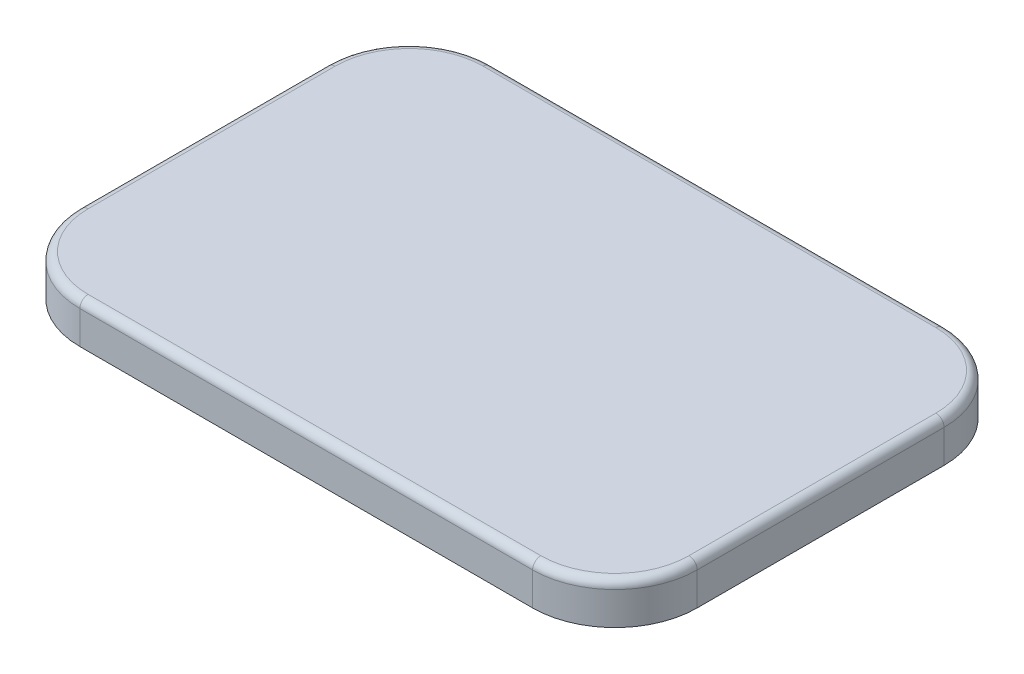
ISO-10303-21;
HEADER;
FILE_DESCRIPTION(('STEP AP214'),'2;1');
FILE_NAME('part.step','',(''),(''),'','','');
FILE_SCHEMA(('AUTOMOTIVE_DESIGN { 1 0 10303 214 1 1 1 1 }'));
ENDSEC;
DATA;
#1=APPLICATION_CONTEXT('core data for automotive mechanical design processes');
#2=APPLICATION_PROTOCOL_DEFINITION('international standard','automotive_design',2000,#1);
#3=PRODUCT_CONTEXT('',#1,'mechanical');
#4=PRODUCT('Part','Part','',(#3));
#5=PRODUCT_RELATED_PRODUCT_CATEGORY('part','',(#4));
#6=PRODUCT_DEFINITION_FORMATION('','',#4);
#7=PRODUCT_DEFINITION_CONTEXT('part definition',#1,'design');
#8=PRODUCT_DEFINITION('design','',#6,#7);
#9=PRODUCT_DEFINITION_SHAPE('','',#8);
#10=(LENGTH_UNIT() NAMED_UNIT(*) SI_UNIT(.MILLI.,.METRE.));
#11=(NAMED_UNIT(*) PLANE_ANGLE_UNIT() SI_UNIT($,.RADIAN.));
#12=(NAMED_UNIT(*) SI_UNIT($,.STERADIAN.) SOLID_ANGLE_UNIT());
#13=UNCERTAINTY_MEASURE_WITH_UNIT(LENGTH_MEASURE(1.E-05),#10,'distance_accuracy_value','');
#14=(GEOMETRIC_REPRESENTATION_CONTEXT(3) GLOBAL_UNCERTAINTY_ASSIGNED_CONTEXT((#13)) GLOBAL_UNIT_ASSIGNED_CONTEXT((#10,
#11,#12)) REPRESENTATION_CONTEXT('',''));
#15=CARTESIAN_POINT('',(0.,0.,0.));
#16=DIRECTION('',(0.,0.,1.));
#17=DIRECTION('',(1.,0.,0.));
#18=AXIS2_PLACEMENT_3D('',#15,#16,#17);
#19=CARTESIAN_POINT('',(-55.,10.,30.));
#20=DIRECTION('',(0.,-1.,0.));
#21=DIRECTION('',(0.,0.,-1.));
#22=AXIS2_PLACEMENT_3D('',#19,#20,#21);
#23=CYLINDRICAL_SURFACE('',#22,20.);
#24=DIRECTION('',(0.,-1.,0.));
#25=VECTOR('',#24,1.);
#26=CARTESIAN_POINT('',(-54.9999999999999,10.,50.));
#27=LINE('',#26,#25);
#28=CARTESIAN_POINT('',(-54.9999999999999,8.,50.));
#29=VERTEX_POINT('',#28);
#30=CARTESIAN_POINT('',(-54.9999999999999,0.,50.));
#31=VERTEX_POINT('',#30);
#32=EDGE_CURVE('E134',#29,#31,#27,.T.);
#33=ORIENTED_EDGE('',*,*,#32,.F.);
#34=CARTESIAN_POINT('',(-55.,8.,30.));
#35=DIRECTION('',(0.,-1.,0.));
#36=DIRECTION('',(0.,0.,-1.));
#37=AXIS2_PLACEMENT_3D('',#34,#35,#36);
#38=CIRCLE('',#37,20.);
#39=CARTESIAN_POINT('',(-75.,8.,29.9999999999999));
#40=VERTEX_POINT('',#39);
#41=EDGE_CURVE('E11',#29,#40,#38,.T.);
#42=ORIENTED_EDGE('',*,*,#41,.T.);
#43=DIRECTION('',(0.,-1.,0.));
#44=VECTOR('',#43,1.);
#45=CARTESIAN_POINT('',(-75.,10.,29.9999999999999));
#46=LINE('',#45,#44);
#47=CARTESIAN_POINT('',(-75.,0.,29.9999999999999));
#48=VERTEX_POINT('',#47);
#49=EDGE_CURVE('E157',#40,#48,#46,.T.);
#50=ORIENTED_EDGE('',*,*,#49,.T.);
#51=CARTESIAN_POINT('',(-55.,0.,30.));
#52=DIRECTION('',(0.,1.,0.));
#53=DIRECTION('',(0.,0.,-1.));
#54=AXIS2_PLACEMENT_3D('',#51,#52,#53);
#55=CIRCLE('',#54,20.);
#56=EDGE_CURVE('E150',#48,#31,#55,.T.);
#57=ORIENTED_EDGE('',*,*,#56,.T.);
#58=EDGE_LOOP('',(#33,#42,#50,#57));
#59=FACE_BOUND('',#58,.T.);
#60=ADVANCED_FACE('F45',(#59),#23,.T.);
#61=CARTESIAN_POINT('',(54.9999999999998,10.,50.));
#62=DIRECTION('',(0.,0.,-1.));
#63=DIRECTION('',(-1.,0.,0.));
#64=AXIS2_PLACEMENT_3D('',#61,#62,#63);
#65=PLANE('',#64);
#66=DIRECTION('',(0.,-1.,0.));
#67=VECTOR('',#66,1.);
#68=CARTESIAN_POINT('',(54.9999999999998,10.,50.));
#69=LINE('',#68,#67);
#70=CARTESIAN_POINT('',(54.9999999999998,8.,50.));
#71=VERTEX_POINT('',#70);
#72=CARTESIAN_POINT('',(54.9999999999998,0.,50.));
#73=VERTEX_POINT('',#72);
#74=EDGE_CURVE('E144',#71,#73,#69,.T.);
#75=ORIENTED_EDGE('',*,*,#74,.F.);
#76=DIRECTION('',(1.,0.,0.));
#77=VECTOR('',#76,1.);
#78=CARTESIAN_POINT('',(54.9999999999998,8.,50.));
#79=LINE('',#78,#77);
#80=EDGE_CURVE('E55',#71,#29,#79,.F.);
#81=ORIENTED_EDGE('',*,*,#80,.T.);
#82=ORIENTED_EDGE('',*,*,#32,.T.);
#83=DIRECTION('',(1.,0.,0.));
#84=VECTOR('',#83,1.);
#85=CARTESIAN_POINT('',(54.9999999999998,0.,50.));
#86=LINE('',#85,#84);
#87=EDGE_CURVE('E137',#31,#73,#86,.T.);
#88=ORIENTED_EDGE('',*,*,#87,.T.);
#89=EDGE_LOOP('',(#75,#81,#82,#88));
#90=FACE_BOUND('',#89,.T.);
#91=ADVANCED_FACE('F136',(#90),#65,.F.);
#92=CARTESIAN_POINT('',(55.,10.,30.));
#93=DIRECTION('',(0.,-1.,0.));
#94=DIRECTION('',(0.,0.,-1.));
#95=AXIS2_PLACEMENT_3D('',#92,#93,#94);
#96=CYLINDRICAL_SURFACE('',#95,20.);
#97=DIRECTION('',(0.,-1.,0.));
#98=VECTOR('',#97,1.);
#99=CARTESIAN_POINT('',(75.,10.,29.9999999999999));
#100=LINE('',#99,#98);
#101=CARTESIAN_POINT('',(75.,8.,29.9999999999999));
#102=VERTEX_POINT('',#101);
#103=CARTESIAN_POINT('',(75.,0.,29.9999999999999));
#104=VERTEX_POINT('',#103);
#105=EDGE_CURVE('E200',#102,#104,#100,.T.);
#106=ORIENTED_EDGE('',*,*,#105,.F.);
#107=CARTESIAN_POINT('',(55.,8.,30.));
#108=DIRECTION('',(0.,-1.,0.));
#109=DIRECTION('',(0.,0.,-1.));
#110=AXIS2_PLACEMENT_3D('',#107,#108,#109);
#111=CIRCLE('',#110,20.);
#112=EDGE_CURVE('E70',#102,#71,#111,.T.);
#113=ORIENTED_EDGE('',*,*,#112,.T.);
#114=ORIENTED_EDGE('',*,*,#74,.T.);
#115=CARTESIAN_POINT('',(55.,0.,30.));
#116=DIRECTION('',(0.,1.,0.));
#117=DIRECTION('',(0.,0.,1.));
#118=AXIS2_PLACEMENT_3D('',#115,#116,#117);
#119=CIRCLE('',#118,20.);
#120=EDGE_CURVE('E153',#73,#104,#119,.T.);
#121=ORIENTED_EDGE('',*,*,#120,.T.);
#122=EDGE_LOOP('',(#106,#113,#114,#121));
#123=FACE_BOUND('',#122,.T.);
#124=ADVANCED_FACE('F327',(#123),#96,.T.);
#125=CARTESIAN_POINT('',(75.,10.,29.9999999999998));
#126=DIRECTION('',(-1.,0.,0.));
#127=DIRECTION('',(0.,0.,1.));
#128=AXIS2_PLACEMENT_3D('',#125,#126,#127);
#129=PLANE('',#128);
#130=DIRECTION('',(0.,-1.,0.));
#131=VECTOR('',#130,1.);
#132=CARTESIAN_POINT('',(75.,10.,-29.9999999999999));
#133=LINE('',#132,#131);
#134=CARTESIAN_POINT('',(75.,8.,-29.9999999999999));
#135=VERTEX_POINT('',#134);
#136=CARTESIAN_POINT('',(75.,0.,-29.9999999999999));
#137=VERTEX_POINT('',#136);
#138=EDGE_CURVE('E197',#135,#137,#133,.T.);
#139=ORIENTED_EDGE('',*,*,#138,.F.);
#140=DIRECTION('',(0.,0.,-1.));
#141=VECTOR('',#140,1.);
#142=CARTESIAN_POINT('',(75.,8.,29.9999999999998));
#143=LINE('',#142,#141);
#144=EDGE_CURVE('E242',#135,#102,#143,.F.);
#145=ORIENTED_EDGE('',*,*,#144,.T.);
#146=ORIENTED_EDGE('',*,*,#105,.T.);
#147=DIRECTION('',(0.,0.,-1.));
#148=VECTOR('',#147,1.);
#149=CARTESIAN_POINT('',(75.,0.,29.9999999999998));
#150=LINE('',#149,#148);
#151=EDGE_CURVE('E167',#104,#137,#150,.T.);
#152=ORIENTED_EDGE('',*,*,#151,.T.);
#153=EDGE_LOOP('',(#139,#145,#146,#152));
#154=FACE_BOUND('',#153,.T.);
#155=ADVANCED_FACE('F325',(#154),#129,.F.);
#156=CARTESIAN_POINT('',(55.,10.,-30.));
#157=DIRECTION('',(0.,-1.,0.));
#158=DIRECTION('',(0.,0.,-1.));
#159=AXIS2_PLACEMENT_3D('',#156,#157,#158);
#160=CYLINDRICAL_SURFACE('',#159,20.);
#161=DIRECTION('',(0.,-1.,0.));
#162=VECTOR('',#161,1.);
#163=CARTESIAN_POINT('',(54.9999999999999,10.,-50.));
#164=LINE('',#163,#162);
#165=CARTESIAN_POINT('',(54.9999999999999,8.,-50.));
#166=VERTEX_POINT('',#165);
#167=CARTESIAN_POINT('',(54.9999999999999,0.,-50.));
#168=VERTEX_POINT('',#167);
#169=EDGE_CURVE('E194',#166,#168,#164,.T.);
#170=ORIENTED_EDGE('',*,*,#169,.F.);
#171=CARTESIAN_POINT('',(55.,8.,-30.));
#172=DIRECTION('',(0.,-1.,0.));
#173=DIRECTION('',(0.,0.,-1.));
#174=AXIS2_PLACEMENT_3D('',#171,#172,#173);
#175=CIRCLE('',#174,20.);
#176=EDGE_CURVE('E239',#166,#135,#175,.T.);
#177=ORIENTED_EDGE('',*,*,#176,.T.);
#178=ORIENTED_EDGE('',*,*,#138,.T.);
#179=CARTESIAN_POINT('',(55.,0.,-30.));
#180=DIRECTION('',(0.,1.,0.));
#181=DIRECTION('',(0.,0.,1.));
#182=AXIS2_PLACEMENT_3D('',#179,#180,#181);
#183=CIRCLE('',#182,20.);
#184=EDGE_CURVE('E171',#137,#168,#183,.T.);
#185=ORIENTED_EDGE('',*,*,#184,.T.);
#186=EDGE_LOOP('',(#170,#177,#178,#185));
#187=FACE_BOUND('',#186,.T.);
#188=ADVANCED_FACE('F323',(#187),#160,.T.);
#189=CARTESIAN_POINT('',(54.9999999999998,10.,-50.));
#190=DIRECTION('',(0.,0.,1.));
#191=DIRECTION('',(1.,0.,0.));
#192=AXIS2_PLACEMENT_3D('',#189,#190,#191);
#193=PLANE('',#192);
#194=DIRECTION('',(0.,-1.,0.));
#195=VECTOR('',#194,1.);
#196=CARTESIAN_POINT('',(-54.9999999999999,10.,-50.));
#197=LINE('',#196,#195);
#198=CARTESIAN_POINT('',(-54.9999999999999,8.,-50.));
#199=VERTEX_POINT('',#198);
#200=CARTESIAN_POINT('',(-54.9999999999999,0.,-50.));
#201=VERTEX_POINT('',#200);
#202=EDGE_CURVE('E191',#199,#201,#197,.T.);
#203=ORIENTED_EDGE('',*,*,#202,.F.);
#204=DIRECTION('',(-1.,0.,0.));
#205=VECTOR('',#204,1.);
#206=CARTESIAN_POINT('',(54.9999999999998,8.,-50.));
#207=LINE('',#206,#205);
#208=EDGE_CURVE('E236',#199,#166,#207,.F.);
#209=ORIENTED_EDGE('',*,*,#208,.T.);
#210=ORIENTED_EDGE('',*,*,#169,.T.);
#211=DIRECTION('',(-1.,0.,0.));
#212=VECTOR('',#211,1.);
#213=CARTESIAN_POINT('',(54.9999999999998,0.,-50.));
#214=LINE('',#213,#212);
#215=EDGE_CURVE('E175',#168,#201,#214,.T.);
#216=ORIENTED_EDGE('',*,*,#215,.T.);
#217=EDGE_LOOP('',(#203,#209,#210,#216));
#218=FACE_BOUND('',#217,.T.);
#219=ADVANCED_FACE('F311',(#218),#193,.F.);
#220=CARTESIAN_POINT('',(-55.,10.,-30.));
#221=DIRECTION('',(0.,-1.,0.));
#222=DIRECTION('',(0.,0.,-1.));
#223=AXIS2_PLACEMENT_3D('',#220,#221,#222);
#224=CYLINDRICAL_SURFACE('',#223,20.);
#225=DIRECTION('',(0.,-1.,0.));
#226=VECTOR('',#225,1.);
#227=CARTESIAN_POINT('',(-75.,10.,-29.9999999999999));
#228=LINE('',#227,#226);
#229=CARTESIAN_POINT('',(-75.,8.,-29.9999999999999));
#230=VERTEX_POINT('',#229);
#231=CARTESIAN_POINT('',(-75.,0.,-29.9999999999999));
#232=VERTEX_POINT('',#231);
#233=EDGE_CURVE('E188',#230,#232,#228,.T.);
#234=ORIENTED_EDGE('',*,*,#233,.F.);
#235=CARTESIAN_POINT('',(-55.,8.,-30.));
#236=DIRECTION('',(0.,-1.,0.));
#237=DIRECTION('',(0.,0.,-1.));
#238=AXIS2_PLACEMENT_3D('',#235,#236,#237);
#239=CIRCLE('',#238,20.);
#240=EDGE_CURVE('E233',#230,#199,#239,.T.);
#241=ORIENTED_EDGE('',*,*,#240,.T.);
#242=ORIENTED_EDGE('',*,*,#202,.T.);
#243=CARTESIAN_POINT('',(-55.,0.,-30.));
#244=DIRECTION('',(0.,1.,0.));
#245=DIRECTION('',(0.,0.,1.));
#246=AXIS2_PLACEMENT_3D('',#243,#244,#245);
#247=CIRCLE('',#246,20.);
#248=EDGE_CURVE('E179',#201,#232,#247,.T.);
#249=ORIENTED_EDGE('',*,*,#248,.T.);
#250=EDGE_LOOP('',(#234,#241,#242,#249));
#251=FACE_BOUND('',#250,.T.);
#252=ADVANCED_FACE('F308',(#251),#224,.T.);
#253=CARTESIAN_POINT('',(-75.,10.,29.9999999999999));
#254=DIRECTION('',(1.,0.,0.));
#255=DIRECTION('',(0.,0.,-1.));
#256=AXIS2_PLACEMENT_3D('',#253,#254,#255);
#257=PLANE('',#256);
#258=ORIENTED_EDGE('',*,*,#49,.F.);
#259=DIRECTION('',(0.,0.,1.));
#260=VECTOR('',#259,1.);
#261=CARTESIAN_POINT('',(-75.,8.,29.9999999999999));
#262=LINE('',#261,#260);
#263=EDGE_CURVE('E229',#40,#230,#262,.F.);
#264=ORIENTED_EDGE('',*,*,#263,.T.);
#265=ORIENTED_EDGE('',*,*,#233,.T.);
#266=DIRECTION('',(0.,0.,1.));
#267=VECTOR('',#266,1.);
#268=CARTESIAN_POINT('',(-75.,0.,29.9999999999999));
#269=LINE('',#268,#267);
#270=EDGE_CURVE('E183',#232,#48,#269,.T.);
#271=ORIENTED_EDGE('',*,*,#270,.T.);
#272=EDGE_LOOP('',(#258,#264,#265,#271));
#273=FACE_BOUND('',#272,.T.);
#274=ADVANCED_FACE('F295',(#273),#257,.F.);
#275=CARTESIAN_POINT('',(-55.,10.,30.));
#276=DIRECTION('',(0.,-1.,0.));
#277=DIRECTION('',(0.,0.,-1.));
#278=AXIS2_PLACEMENT_3D('',#275,#276,#277);
#279=PLANE('',#278);
#280=CARTESIAN_POINT('',(-55.,10.,-30.));
#281=DIRECTION('',(0.,-1.,0.));
#282=DIRECTION('',(0.,0.,-1.));
#283=AXIS2_PLACEMENT_3D('',#280,#281,#282);
#284=CIRCLE('',#283,18.);
#285=CARTESIAN_POINT('',(-54.9999999999999,10.,-48.));
#286=VERTEX_POINT('',#285);
#287=CARTESIAN_POINT('',(-73.,10.,-29.9999999999999));
#288=VERTEX_POINT('',#287);
#289=EDGE_CURVE('E222',#286,#288,#284,.F.);
#290=ORIENTED_EDGE('',*,*,#289,.T.);
#291=DIRECTION('',(0.,0.,1.));
#292=VECTOR('',#291,1.);
#293=CARTESIAN_POINT('',(-73.,10.,30.));
#294=LINE('',#293,#292);
#295=CARTESIAN_POINT('',(-73.,10.,29.9999999999999));
#296=VERTEX_POINT('',#295);
#297=EDGE_CURVE('E225',#288,#296,#294,.T.);
#298=ORIENTED_EDGE('',*,*,#297,.T.);
#299=CARTESIAN_POINT('',(-55.,10.,30.));
#300=DIRECTION('',(0.,-1.,0.));
#301=DIRECTION('',(0.,0.,-1.));
#302=AXIS2_PLACEMENT_3D('',#299,#300,#301);
#303=CIRCLE('',#302,18.);
#304=CARTESIAN_POINT('',(-54.9999999999999,10.,48.));
#305=VERTEX_POINT('',#304);
#306=EDGE_CURVE('E143',#296,#305,#303,.F.);
#307=ORIENTED_EDGE('',*,*,#306,.T.);
#308=DIRECTION('',(1.,0.,0.));
#309=VECTOR('',#308,1.);
#310=CARTESIAN_POINT('',(-55.,10.,48.));
#311=LINE('',#310,#309);
#312=CARTESIAN_POINT('',(54.9999999999999,10.,48.));
#313=VERTEX_POINT('',#312);
#314=EDGE_CURVE('E207',#305,#313,#311,.T.);
#315=ORIENTED_EDGE('',*,*,#314,.T.);
#316=CARTESIAN_POINT('',(55.,10.,30.));
#317=DIRECTION('',(0.,-1.,0.));
#318=DIRECTION('',(0.,0.,-1.));
#319=AXIS2_PLACEMENT_3D('',#316,#317,#318);
#320=CIRCLE('',#319,18.);
#321=CARTESIAN_POINT('',(73.,10.,29.9999999999999));
#322=VERTEX_POINT('',#321);
#323=EDGE_CURVE('E210',#313,#322,#320,.F.);
#324=ORIENTED_EDGE('',*,*,#323,.T.);
#325=DIRECTION('',(0.,0.,-1.));
#326=VECTOR('',#325,1.);
#327=CARTESIAN_POINT('',(73.,10.,30.));
#328=LINE('',#327,#326);
#329=CARTESIAN_POINT('',(73.,10.,-29.9999999999999));
#330=VERTEX_POINT('',#329);
#331=EDGE_CURVE('E213',#322,#330,#328,.T.);
#332=ORIENTED_EDGE('',*,*,#331,.T.);
#333=CARTESIAN_POINT('',(55.,10.,-30.));
#334=DIRECTION('',(0.,-1.,0.));
#335=DIRECTION('',(0.,0.,-1.));
#336=AXIS2_PLACEMENT_3D('',#333,#334,#335);
#337=CIRCLE('',#336,18.);
#338=CARTESIAN_POINT('',(54.9999999999999,10.,-48.));
#339=VERTEX_POINT('',#338);
#340=EDGE_CURVE('E216',#330,#339,#337,.F.);
#341=ORIENTED_EDGE('',*,*,#340,.T.);
#342=DIRECTION('',(-1.,0.,0.));
#343=VECTOR('',#342,1.);
#344=CARTESIAN_POINT('',(-55.,10.,-48.));
#345=LINE('',#344,#343);
#346=EDGE_CURVE('E219',#339,#286,#345,.T.);
#347=ORIENTED_EDGE('',*,*,#346,.T.);
#348=EDGE_LOOP('',(#290,#298,#307,#315,#324,#332,#341,#347));
#349=FACE_BOUND('',#348,.T.);
#350=ADVANCED_FACE('F283',(#349),#279,.F.);
#351=CARTESIAN_POINT('',(-55.,0.,30.));
#352=DIRECTION('',(0.,-1.,0.));
#353=DIRECTION('',(0.,0.,-1.));
#354=AXIS2_PLACEMENT_3D('',#351,#352,#353);
#355=PLANE('',#354);
#356=ORIENTED_EDGE('',*,*,#56,.F.);
#357=ORIENTED_EDGE('',*,*,#270,.F.);
#358=ORIENTED_EDGE('',*,*,#248,.F.);
#359=ORIENTED_EDGE('',*,*,#215,.F.);
#360=ORIENTED_EDGE('',*,*,#184,.F.);
#361=ORIENTED_EDGE('',*,*,#151,.F.);
#362=ORIENTED_EDGE('',*,*,#120,.F.);
#363=ORIENTED_EDGE('',*,*,#87,.F.);
#364=EDGE_LOOP('',(#356,#357,#358,#359,#360,#361,#362,#363));
#365=FACE_BOUND('',#364,.T.);
#366=ADVANCED_FACE('F148',(#365),#355,.T.);
#367=CARTESIAN_POINT('',(73.,8.,30.));
#368=DIRECTION('',(0.,0.,-1.));
#369=DIRECTION('',(-1.,0.,0.));
#370=AXIS2_PLACEMENT_3D('',#367,#368,#369);
#371=CYLINDRICAL_SURFACE('',#370,2.);
#372=CARTESIAN_POINT('',(73.,8.,29.9999999999999));
#373=DIRECTION('',(0.,0.,1.));
#374=DIRECTION('',(1.,0.,0.));
#375=AXIS2_PLACEMENT_3D('',#372,#373,#374);
#376=CIRCLE('',#375,2.);
#377=EDGE_CURVE('E163',#102,#322,#376,.T.);
#378=ORIENTED_EDGE('',*,*,#377,.F.);
#379=ORIENTED_EDGE('',*,*,#144,.F.);
#380=CARTESIAN_POINT('',(73.,8.,-29.9999999999999));
#381=DIRECTION('',(0.,0.,-1.));
#382=DIRECTION('',(-1.,0.,0.));
#383=AXIS2_PLACEMENT_3D('',#380,#381,#382);
#384=CIRCLE('',#383,2.);
#385=EDGE_CURVE('E49',#330,#135,#384,.T.);
#386=ORIENTED_EDGE('',*,*,#385,.F.);
#387=ORIENTED_EDGE('',*,*,#331,.F.);
#388=EDGE_LOOP('',(#378,#379,#386,#387));
#389=FACE_BOUND('',#388,.T.);
#390=ADVANCED_FACE('F47',(#389),#371,.T.);
#391=CARTESIAN_POINT('',(55.,8.,-30.));
#392=DIRECTION('',(0.,-1.,0.));
#393=DIRECTION('',(0.,0.,-1.));
#394=AXIS2_PLACEMENT_3D('',#391,#392,#393);
#395=TOROIDAL_SURFACE('',#394,18.,2.);
#396=ORIENTED_EDGE('',*,*,#385,.T.);
#397=ORIENTED_EDGE('',*,*,#176,.F.);
#398=CARTESIAN_POINT('',(54.9999999999999,8.,-48.));
#399=DIRECTION('',(-1.,0.,0.));
#400=DIRECTION('',(0.,0.,1.));
#401=AXIS2_PLACEMENT_3D('',#398,#399,#400);
#402=CIRCLE('',#401,2.);
#403=EDGE_CURVE('E267',#339,#166,#402,.T.);
#404=ORIENTED_EDGE('',*,*,#403,.F.);
#405=ORIENTED_EDGE('',*,*,#340,.F.);
#406=EDGE_LOOP('',(#396,#397,#404,#405));
#407=FACE_BOUND('',#406,.T.);
#408=ADVANCED_FACE('F320',(#407),#395,.T.);
#409=CARTESIAN_POINT('',(55.,8.,30.));
#410=DIRECTION('',(0.,-1.,0.));
#411=DIRECTION('',(0.,0.,-1.));
#412=AXIS2_PLACEMENT_3D('',#409,#410,#411);
#413=TOROIDAL_SURFACE('',#412,18.,2.);
#414=ORIENTED_EDGE('',*,*,#377,.T.);
#415=ORIENTED_EDGE('',*,*,#323,.F.);
#416=CARTESIAN_POINT('',(54.9999999999999,8.,48.));
#417=DIRECTION('',(-1.,0.,0.));
#418=DIRECTION('',(0.,0.,1.));
#419=AXIS2_PLACEMENT_3D('',#416,#417,#418);
#420=CIRCLE('',#419,2.);
#421=EDGE_CURVE('E263',#71,#313,#420,.T.);
#422=ORIENTED_EDGE('',*,*,#421,.F.);
#423=ORIENTED_EDGE('',*,*,#112,.F.);
#424=EDGE_LOOP('',(#414,#415,#422,#423));
#425=FACE_BOUND('',#424,.T.);
#426=ADVANCED_FACE('F275',(#425),#413,.T.);
#427=CARTESIAN_POINT('',(-55.,8.,-48.));
#428=DIRECTION('',(-1.,0.,0.));
#429=DIRECTION('',(0.,0.,1.));
#430=AXIS2_PLACEMENT_3D('',#427,#428,#429);
#431=CYLINDRICAL_SURFACE('',#430,2.);
#432=ORIENTED_EDGE('',*,*,#403,.T.);
#433=ORIENTED_EDGE('',*,*,#208,.F.);
#434=CARTESIAN_POINT('',(-54.9999999999999,8.,-48.));
#435=DIRECTION('',(-1.,0.,0.));
#436=DIRECTION('',(0.,0.,1.));
#437=AXIS2_PLACEMENT_3D('',#434,#435,#436);
#438=CIRCLE('',#437,2.);
#439=EDGE_CURVE('E259',#286,#199,#438,.T.);
#440=ORIENTED_EDGE('',*,*,#439,.F.);
#441=ORIENTED_EDGE('',*,*,#346,.F.);
#442=EDGE_LOOP('',(#432,#433,#440,#441));
#443=FACE_BOUND('',#442,.T.);
#444=ADVANCED_FACE('F316',(#443),#431,.T.);
#445=CARTESIAN_POINT('',(-55.,8.,48.));
#446=DIRECTION('',(1.,0.,0.));
#447=DIRECTION('',(0.,0.,-1.));
#448=AXIS2_PLACEMENT_3D('',#445,#446,#447);
#449=CYLINDRICAL_SURFACE('',#448,2.);
#450=ORIENTED_EDGE('',*,*,#421,.T.);
#451=ORIENTED_EDGE('',*,*,#314,.F.);
#452=CARTESIAN_POINT('',(-54.9999999999999,8.,48.));
#453=DIRECTION('',(-1.,0.,0.));
#454=DIRECTION('',(0.,0.,1.));
#455=AXIS2_PLACEMENT_3D('',#452,#453,#454);
#456=CIRCLE('',#455,2.);
#457=EDGE_CURVE('E255',#29,#305,#456,.T.);
#458=ORIENTED_EDGE('',*,*,#457,.F.);
#459=ORIENTED_EDGE('',*,*,#80,.F.);
#460=EDGE_LOOP('',(#450,#451,#458,#459));
#461=FACE_BOUND('',#460,.T.);
#462=ADVANCED_FACE('F288',(#461),#449,.T.);
#463=CARTESIAN_POINT('',(-55.,8.,-30.));
#464=DIRECTION('',(0.,-1.,0.));
#465=DIRECTION('',(0.,0.,-1.));
#466=AXIS2_PLACEMENT_3D('',#463,#464,#465);
#467=TOROIDAL_SURFACE('',#466,18.,2.);
#468=ORIENTED_EDGE('',*,*,#439,.T.);
#469=ORIENTED_EDGE('',*,*,#240,.F.);
#470=CARTESIAN_POINT('',(-73.,8.,-29.9999999999999));
#471=DIRECTION('',(0.,0.,1.));
#472=DIRECTION('',(1.,0.,0.));
#473=AXIS2_PLACEMENT_3D('',#470,#471,#472);
#474=CIRCLE('',#473,2.);
#475=EDGE_CURVE('E252',#288,#230,#474,.T.);
#476=ORIENTED_EDGE('',*,*,#475,.F.);
#477=ORIENTED_EDGE('',*,*,#289,.F.);
#478=EDGE_LOOP('',(#468,#469,#476,#477));
#479=FACE_BOUND('',#478,.T.);
#480=ADVANCED_FACE('F304',(#479),#467,.T.);
#481=CARTESIAN_POINT('',(-55.,8.,30.));
#482=DIRECTION('',(0.,-1.,0.));
#483=DIRECTION('',(0.,0.,-1.));
#484=AXIS2_PLACEMENT_3D('',#481,#482,#483);
#485=TOROIDAL_SURFACE('',#484,18.,2.);
#486=ORIENTED_EDGE('',*,*,#457,.T.);
#487=ORIENTED_EDGE('',*,*,#306,.F.);
#488=CARTESIAN_POINT('',(-73.,8.,29.9999999999999));
#489=DIRECTION('',(0.,0.,-1.));
#490=DIRECTION('',(0.,1.,0.));
#491=AXIS2_PLACEMENT_3D('',#488,#489,#490);
#492=CIRCLE('',#491,2.);
#493=EDGE_CURVE('E249',#40,#296,#492,.T.);
#494=ORIENTED_EDGE('',*,*,#493,.F.);
#495=ORIENTED_EDGE('',*,*,#41,.F.);
#496=EDGE_LOOP('',(#486,#487,#494,#495));
#497=FACE_BOUND('',#496,.T.);
#498=ADVANCED_FACE('F291',(#497),#485,.T.);
#499=CARTESIAN_POINT('',(-73.,8.,30.));
#500=DIRECTION('',(0.,0.,1.));
#501=DIRECTION('',(1.,0.,0.));
#502=AXIS2_PLACEMENT_3D('',#499,#500,#501);
#503=CYLINDRICAL_SURFACE('',#502,2.);
#504=ORIENTED_EDGE('',*,*,#475,.T.);
#505=ORIENTED_EDGE('',*,*,#263,.F.);
#506=ORIENTED_EDGE('',*,*,#493,.T.);
#507=ORIENTED_EDGE('',*,*,#297,.F.);
#508=EDGE_LOOP('',(#504,#505,#506,#507));
#509=FACE_BOUND('',#508,.T.);
#510=ADVANCED_FACE('F298',(#509),#503,.T.);
#511=CLOSED_SHELL('',(#60,#91,#124,#155,#188,#219,#252,#274,#350,#366,#390,#408,#426,#444,#462,
#480,#498,#510));
#512=MANIFOLD_SOLID_BREP('B2',#511);
#513=ADVANCED_BREP_SHAPE_REPRESENTATION('',(#18,#512),#14);
#514=SHAPE_DEFINITION_REPRESENTATION(#9,#513);
ENDSEC;
END-ISO-10303-21;
